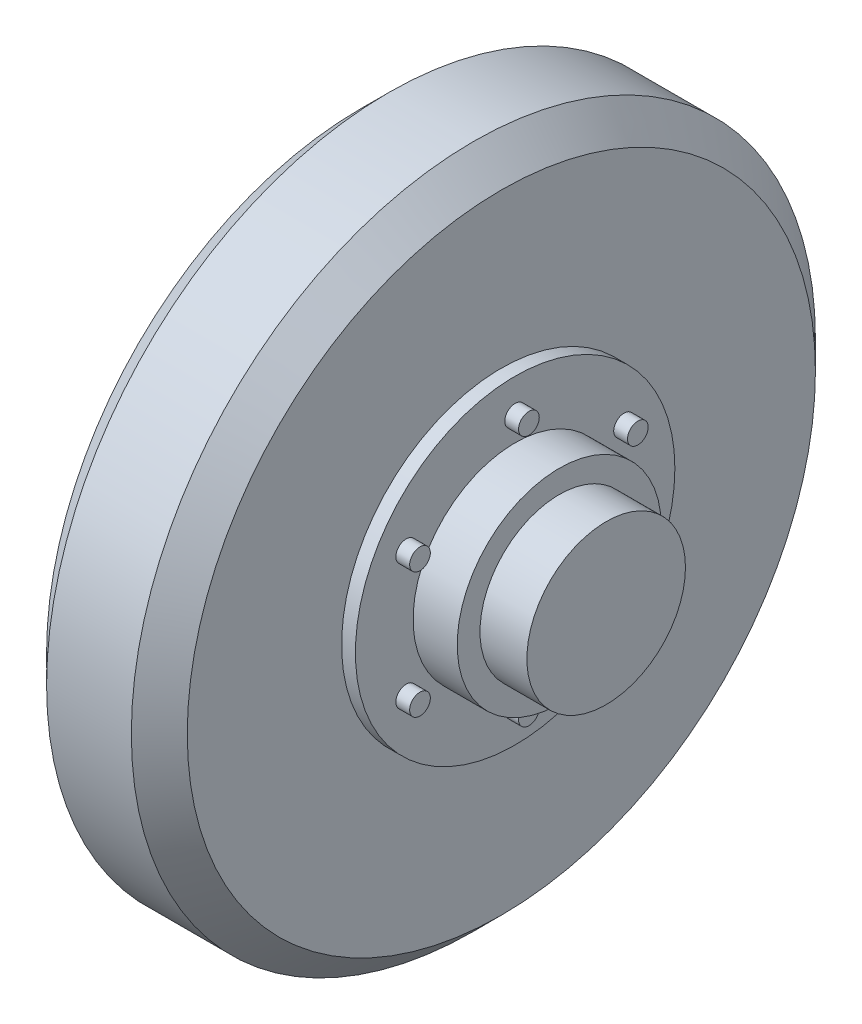
ISO-10303-21;
HEADER;
FILE_DESCRIPTION(('STEP AP214'),'2;1');
FILE_NAME('part.step','',(''),(''),'','','');
FILE_SCHEMA(('AUTOMOTIVE_DESIGN { 1 0 10303 214 1 1 1 1 }'));
ENDSEC;
DATA;
#1=APPLICATION_CONTEXT('core data for automotive mechanical design processes');
#2=APPLICATION_PROTOCOL_DEFINITION('international standard','automotive_design',2000,#1);
#3=PRODUCT_CONTEXT('',#1,'mechanical');
#4=PRODUCT('Part','Part','',(#3));
#5=PRODUCT_RELATED_PRODUCT_CATEGORY('part','',(#4));
#6=PRODUCT_DEFINITION_FORMATION('','',#4);
#7=PRODUCT_DEFINITION_CONTEXT('part definition',#1,'design');
#8=PRODUCT_DEFINITION('design','',#6,#7);
#9=PRODUCT_DEFINITION_SHAPE('','',#8);
#10=(LENGTH_UNIT() NAMED_UNIT(*) SI_UNIT(.MILLI.,.METRE.));
#11=(NAMED_UNIT(*) PLANE_ANGLE_UNIT() SI_UNIT($,.RADIAN.));
#12=(NAMED_UNIT(*) SI_UNIT($,.STERADIAN.) SOLID_ANGLE_UNIT());
#13=UNCERTAINTY_MEASURE_WITH_UNIT(LENGTH_MEASURE(1.E-05),#10,'distance_accuracy_value','');
#14=(GEOMETRIC_REPRESENTATION_CONTEXT(3) GLOBAL_UNCERTAINTY_ASSIGNED_CONTEXT((#13)) GLOBAL_UNIT_ASSIGNED_CONTEXT((#10,
#11,#12)) REPRESENTATION_CONTEXT('',''));
#15=CARTESIAN_POINT('',(0.,0.,0.));
#16=DIRECTION('',(0.,0.,1.));
#17=DIRECTION('',(1.,0.,0.));
#18=AXIS2_PLACEMENT_3D('',#15,#16,#17);
#19=CARTESIAN_POINT('',(20.32,0.,0.));
#20=DIRECTION('',(1.,0.,0.));
#21=DIRECTION('',(0.,0.,-1.));
#22=AXIS2_PLACEMENT_3D('',#19,#20,#21);
#23=PLANE('',#22);
#24=CARTESIAN_POINT('',(20.32,0.,0.));
#25=DIRECTION('',(1.,0.,0.));
#26=DIRECTION('',(0.,0.,-1.));
#27=AXIS2_PLACEMENT_3D('',#24,#25,#26);
#28=CIRCLE('',#27,46.99);
#29=CARTESIAN_POINT('',(20.32,0.,-46.99));
#30=VERTEX_POINT('',#29);
#31=EDGE_CURVE('E85',#30,#30,#28,.T.);
#32=ORIENTED_EDGE('',*,*,#31,.T.);
#33=EDGE_LOOP('',(#32));
#34=FACE_BOUND('',#33,.T.);
#35=CARTESIAN_POINT('',(20.32,0.,0.));
#36=DIRECTION('',(1.,0.,0.));
#37=DIRECTION('',(0.,0.,-1.));
#38=AXIS2_PLACEMENT_3D('',#35,#36,#37);
#39=CIRCLE('',#38,36.5125);
#40=CARTESIAN_POINT('',(20.32,0.,-36.5125));
#41=VERTEX_POINT('',#40);
#42=EDGE_CURVE('E10',#41,#41,#39,.T.);
#43=ORIENTED_EDGE('',*,*,#42,.F.);
#44=EDGE_LOOP('',(#43));
#45=FACE_BOUND('',#44,.T.);
#46=ADVANCED_FACE('F39',(#34,#45),#23,.T.);
#47=CARTESIAN_POINT('',(0.,0.,0.));
#48=DIRECTION('',(1.,0.,0.));
#49=DIRECTION('',(0.,0.,-1.));
#50=AXIS2_PLACEMENT_3D('',#47,#48,#49);
#51=CYLINDRICAL_SURFACE('',#50,36.5125);
#52=CARTESIAN_POINT('',(41.91,0.,0.));
#53=DIRECTION('',(1.,0.,0.));
#54=DIRECTION('',(0.,0.,-1.));
#55=AXIS2_PLACEMENT_3D('',#52,#53,#54);
#56=CIRCLE('',#55,36.5125);
#57=CARTESIAN_POINT('',(41.91,0.,-36.5125));
#58=VERTEX_POINT('',#57);
#59=EDGE_CURVE('E45',#58,#58,#56,.T.);
#60=ORIENTED_EDGE('',*,*,#59,.F.);
#61=EDGE_LOOP('',(#60));
#62=FACE_BOUND('',#61,.T.);
#63=ORIENTED_EDGE('',*,*,#42,.T.);
#64=EDGE_LOOP('',(#63));
#65=FACE_BOUND('',#64,.T.);
#66=ADVANCED_FACE('F184',(#62,#65),#51,.T.);
#67=CARTESIAN_POINT('',(41.91,0.,0.));
#68=DIRECTION('',(1.,0.,0.));
#69=DIRECTION('',(0.,0.,-1.));
#70=AXIS2_PLACEMENT_3D('',#67,#68,#69);
#71=PLANE('',#70);
#72=ORIENTED_EDGE('',*,*,#59,.T.);
#73=EDGE_LOOP('',(#72));
#74=FACE_BOUND('',#73,.T.);
#75=ADVANCED_FACE('F189',(#74),#71,.T.);
#76=CARTESIAN_POINT('',(-90.17,0.,0.));
#77=DIRECTION('',(1.,0.,0.));
#78=DIRECTION('',(0.,0.,-1.));
#79=AXIS2_PLACEMENT_3D('',#76,#77,#78);
#80=PLANE('',#79);
#81=CARTESIAN_POINT('',(-90.17,0.,0.));
#82=DIRECTION('',(1.,0.,0.));
#83=DIRECTION('',(0.,0.,-1.));
#84=AXIS2_PLACEMENT_3D('',#81,#82,#83);
#85=CIRCLE('',#84,24.13);
#86=CARTESIAN_POINT('',(-90.17,0.,-24.13));
#87=VERTEX_POINT('',#86);
#88=EDGE_CURVE('E49',#87,#87,#85,.T.);
#89=ORIENTED_EDGE('',*,*,#88,.F.);
#90=EDGE_LOOP('',(#89));
#91=FACE_BOUND('',#90,.T.);
#92=ADVANCED_FACE('F195',(#91),#80,.F.);
#93=CARTESIAN_POINT('',(0.,0.,0.));
#94=DIRECTION('',(1.,0.,0.));
#95=DIRECTION('',(0.,0.,-1.));
#96=AXIS2_PLACEMENT_3D('',#93,#94,#95);
#97=CYLINDRICAL_SURFACE('',#96,24.13);
#98=ORIENTED_EDGE('',*,*,#88,.T.);
#99=EDGE_LOOP('',(#98));
#100=FACE_BOUND('',#99,.T.);
#101=CARTESIAN_POINT('',(-83.82,0.,0.));
#102=DIRECTION('',(1.,0.,0.));
#103=DIRECTION('',(0.,0.,-1.));
#104=AXIS2_PLACEMENT_3D('',#101,#102,#103);
#105=CIRCLE('',#104,24.13);
#106=CARTESIAN_POINT('',(-83.82,0.,-24.13));
#107=VERTEX_POINT('',#106);
#108=EDGE_CURVE('E53',#107,#107,#105,.T.);
#109=ORIENTED_EDGE('',*,*,#108,.F.);
#110=EDGE_LOOP('',(#109));
#111=FACE_BOUND('',#110,.T.);
#112=ADVANCED_FACE('F200',(#100,#111),#97,.T.);
#113=CARTESIAN_POINT('',(-83.82,0.,0.));
#114=DIRECTION('',(1.,0.,0.));
#115=DIRECTION('',(0.,0.,-1.));
#116=AXIS2_PLACEMENT_3D('',#113,#114,#115);
#117=PLANE('',#116);
#118=ORIENTED_EDGE('',*,*,#108,.T.);
#119=EDGE_LOOP('',(#118));
#120=FACE_BOUND('',#119,.T.);
#121=CARTESIAN_POINT('',(-83.82,0.,0.));
#122=DIRECTION('',(1.,0.,0.));
#123=DIRECTION('',(0.,0.,-1.));
#124=AXIS2_PLACEMENT_3D('',#121,#122,#123);
#125=CIRCLE('',#124,14.9987);
#126=CARTESIAN_POINT('',(-83.82,0.,-14.9987));
#127=VERTEX_POINT('',#126);
#128=EDGE_CURVE('E58',#127,#127,#125,.T.);
#129=ORIENTED_EDGE('',*,*,#128,.F.);
#130=EDGE_LOOP('',(#129));
#131=FACE_BOUND('',#130,.T.);
#132=ADVANCED_FACE('F204',(#120,#131),#117,.T.);
#133=CARTESIAN_POINT('',(0.,0.,0.));
#134=DIRECTION('',(1.,0.,0.));
#135=DIRECTION('',(0.,0.,-1.));
#136=AXIS2_PLACEMENT_3D('',#133,#134,#135);
#137=CYLINDRICAL_SURFACE('',#136,14.9987);
#138=ORIENTED_EDGE('',*,*,#128,.T.);
#139=EDGE_LOOP('',(#138));
#140=FACE_BOUND('',#139,.T.);
#141=CARTESIAN_POINT('',(-71.12,0.,0.));
#142=DIRECTION('',(1.,0.,0.));
#143=DIRECTION('',(0.,0.,-1.));
#144=AXIS2_PLACEMENT_3D('',#141,#142,#143);
#145=CIRCLE('',#144,14.9987);
#146=CARTESIAN_POINT('',(-71.12,0.,-14.9987));
#147=VERTEX_POINT('',#146);
#148=EDGE_CURVE('E61',#147,#147,#145,.T.);
#149=ORIENTED_EDGE('',*,*,#148,.F.);
#150=EDGE_LOOP('',(#149));
#151=FACE_BOUND('',#150,.T.);
#152=ADVANCED_FACE('F208',(#140,#151),#137,.T.);
#153=CARTESIAN_POINT('',(-71.12,0.,0.));
#154=DIRECTION('',(1.,0.,0.));
#155=DIRECTION('',(0.,0.,-1.));
#156=AXIS2_PLACEMENT_3D('',#153,#154,#155);
#157=PLANE('',#156);
#158=CARTESIAN_POINT('',(-71.12,36.2352532708454,-11.7735474856855));
#159=DIRECTION('',(-1.,0.,0.));
#160=DIRECTION('',(0.,0.,1.));
#161=AXIS2_PLACEMENT_3D('',#158,#159,#160);
#162=CIRCLE('',#161,3.3734375);
#163=CARTESIAN_POINT('',(-71.12,36.2352532708454,-8.40010998568549));
#164=VERTEX_POINT('',#163);
#165=EDGE_CURVE('E98',#164,#164,#162,.T.);
#166=ORIENTED_EDGE('',*,*,#165,.F.);
#167=EDGE_LOOP('',(#166));
#168=FACE_BOUND('',#167,.T.);
#169=CARTESIAN_POINT('',(-71.12,0.,-38.1));
#170=DIRECTION('',(-1.,0.,0.));
#171=DIRECTION('',(0.,0.,1.));
#172=AXIS2_PLACEMENT_3D('',#169,#170,#171);
#173=CIRCLE('',#172,3.3734375);
#174=CARTESIAN_POINT('',(-71.12,0.,-34.7265625));
#175=VERTEX_POINT('',#174);
#176=EDGE_CURVE('E105',#175,#175,#173,.T.);
#177=ORIENTED_EDGE('',*,*,#176,.F.);
#178=EDGE_LOOP('',(#177));
#179=FACE_BOUND('',#178,.T.);
#180=CARTESIAN_POINT('',(-71.12,-36.2352532708454,-11.7735474856855));
#181=DIRECTION('',(-1.,0.,0.));
#182=DIRECTION('',(0.,0.,1.));
#183=AXIS2_PLACEMENT_3D('',#180,#181,#182);
#184=CIRCLE('',#183,3.3734375);
#185=CARTESIAN_POINT('',(-71.12,-36.2352532708454,-8.40010998568553));
#186=VERTEX_POINT('',#185);
#187=EDGE_CURVE('E111',#186,#186,#184,.T.);
#188=ORIENTED_EDGE('',*,*,#187,.F.);
#189=EDGE_LOOP('',(#188));
#190=FACE_BOUND('',#189,.T.);
#191=CARTESIAN_POINT('',(-71.12,-22.3946181123433,30.8235474856855));
#192=DIRECTION('',(-1.,0.,0.));
#193=DIRECTION('',(0.,0.,1.));
#194=AXIS2_PLACEMENT_3D('',#191,#192,#193);
#195=CIRCLE('',#194,3.3734375);
#196=CARTESIAN_POINT('',(-71.12,-22.3946181123433,34.1969849856855));
#197=VERTEX_POINT('',#196);
#198=EDGE_CURVE('E92',#197,#197,#195,.T.);
#199=ORIENTED_EDGE('',*,*,#198,.F.);
#200=EDGE_LOOP('',(#199));
#201=FACE_BOUND('',#200,.T.);
#202=CARTESIAN_POINT('',(-71.12,22.3946181123432,30.8235474856855));
#203=DIRECTION('',(-1.,0.,0.));
#204=DIRECTION('',(0.,0.,1.));
#205=AXIS2_PLACEMENT_3D('',#202,#203,#204);
#206=CIRCLE('',#205,3.3734375);
#207=CARTESIAN_POINT('',(-71.12,22.3946181123432,34.1969849856855));
#208=VERTEX_POINT('',#207);
#209=EDGE_CURVE('E89',#208,#208,#206,.T.);
#210=ORIENTED_EDGE('',*,*,#209,.F.);
#211=EDGE_LOOP('',(#210));
#212=FACE_BOUND('',#211,.T.);
#213=CARTESIAN_POINT('',(-71.12,0.,0.));
#214=DIRECTION('',(1.,0.,0.));
#215=DIRECTION('',(0.,0.,-1.));
#216=AXIS2_PLACEMENT_3D('',#213,#214,#215);
#217=CIRCLE('',#216,144.605660923727);
#218=CARTESIAN_POINT('',(-71.12,0.,-144.605660923727));
#219=VERTEX_POINT('',#218);
#220=EDGE_CURVE('E64',#219,#219,#217,.T.);
#221=ORIENTED_EDGE('',*,*,#220,.F.);
#222=EDGE_LOOP('',(#221));
#223=FACE_BOUND('',#222,.T.);
#224=ORIENTED_EDGE('',*,*,#148,.T.);
#225=EDGE_LOOP('',(#224));
#226=FACE_BOUND('',#225,.T.);
#227=ADVANCED_FACE('F212',(#168,#179,#190,#201,#212,#223,#226),#157,.F.);
#228=CARTESIAN_POINT('',(-58.2456609237275,0.,0.));
#229=DIRECTION('',(1.,0.,0.));
#230=DIRECTION('',(0.,0.,-1.));
#231=AXIS2_PLACEMENT_3D('',#228,#229,#230);
#232=CONICAL_SURFACE('',#231,157.48,0.78539816339745);
#233=ORIENTED_EDGE('',*,*,#220,.T.);
#234=EDGE_LOOP('',(#233));
#235=FACE_BOUND('',#234,.T.);
#236=CARTESIAN_POINT('',(-58.2456609237275,0.,0.));
#237=DIRECTION('',(1.,0.,0.));
#238=DIRECTION('',(0.,0.,-1.));
#239=AXIS2_PLACEMENT_3D('',#236,#237,#238);
#240=CIRCLE('',#239,157.48);
#241=CARTESIAN_POINT('',(-58.2456609237275,0.,-157.48));
#242=VERTEX_POINT('',#241);
#243=EDGE_CURVE('E67',#242,#242,#240,.T.);
#244=ORIENTED_EDGE('',*,*,#243,.F.);
#245=EDGE_LOOP('',(#244));
#246=FACE_BOUND('',#245,.T.);
#247=ADVANCED_FACE('F215',(#235,#246),#232,.T.);
#248=CARTESIAN_POINT('',(0.,0.,0.));
#249=DIRECTION('',(1.,0.,0.));
#250=DIRECTION('',(0.,0.,-1.));
#251=AXIS2_PLACEMENT_3D('',#248,#249,#250);
#252=CYLINDRICAL_SURFACE('',#251,157.48);
#253=ORIENTED_EDGE('',*,*,#243,.T.);
#254=EDGE_LOOP('',(#253));
#255=FACE_BOUND('',#254,.T.);
#256=CARTESIAN_POINT('',(-19.2243390762724,0.,0.));
#257=DIRECTION('',(1.,0.,0.));
#258=DIRECTION('',(0.,0.,-1.));
#259=AXIS2_PLACEMENT_3D('',#256,#257,#258);
#260=CIRCLE('',#259,157.48);
#261=CARTESIAN_POINT('',(-19.2243390762724,0.,-157.48));
#262=VERTEX_POINT('',#261);
#263=EDGE_CURVE('E70',#262,#262,#260,.T.);
#264=ORIENTED_EDGE('',*,*,#263,.F.);
#265=EDGE_LOOP('',(#264));
#266=FACE_BOUND('',#265,.T.);
#267=ADVANCED_FACE('F219',(#255,#266),#252,.T.);
#268=CARTESIAN_POINT('',(-6.34999999999999,0.,0.));
#269=DIRECTION('',(-1.,0.,0.));
#270=DIRECTION('',(0.,0.,1.));
#271=AXIS2_PLACEMENT_3D('',#268,#269,#270);
#272=CONICAL_SURFACE('',#271,144.605660923727,0.785398163397451);
#273=ORIENTED_EDGE('',*,*,#263,.T.);
#274=EDGE_LOOP('',(#273));
#275=FACE_BOUND('',#274,.T.);
#276=CARTESIAN_POINT('',(-6.34999999999999,0.,0.));
#277=DIRECTION('',(1.,0.,0.));
#278=DIRECTION('',(0.,0.,-1.));
#279=AXIS2_PLACEMENT_3D('',#276,#277,#278);
#280=CIRCLE('',#279,144.605660923727);
#281=CARTESIAN_POINT('',(-6.34999999999999,0.,-144.605660923727));
#282=VERTEX_POINT('',#281);
#283=EDGE_CURVE('E73',#282,#282,#280,.T.);
#284=ORIENTED_EDGE('',*,*,#283,.F.);
#285=EDGE_LOOP('',(#284));
#286=FACE_BOUND('',#285,.T.);
#287=ADVANCED_FACE('F223',(#275,#286),#272,.T.);
#288=CARTESIAN_POINT('',(-6.34999999999999,0.,0.));
#289=DIRECTION('',(1.,0.,0.));
#290=DIRECTION('',(0.,0.,-1.));
#291=AXIS2_PLACEMENT_3D('',#288,#289,#290);
#292=PLANE('',#291);
#293=ORIENTED_EDGE('',*,*,#283,.T.);
#294=EDGE_LOOP('',(#293));
#295=FACE_BOUND('',#294,.T.);
#296=CARTESIAN_POINT('',(-6.34999999999999,0.,0.));
#297=DIRECTION('',(1.,0.,0.));
#298=DIRECTION('',(0.,0.,-1.));
#299=AXIS2_PLACEMENT_3D('',#296,#297,#298);
#300=CIRCLE('',#299,73.5501232622492);
#301=CARTESIAN_POINT('',(-6.34999999999999,0.,-73.5501232622492));
#302=VERTEX_POINT('',#301);
#303=EDGE_CURVE('E76',#302,#302,#300,.T.);
#304=ORIENTED_EDGE('',*,*,#303,.F.);
#305=EDGE_LOOP('',(#304));
#306=FACE_BOUND('',#305,.T.);
#307=ADVANCED_FACE('F227',(#295,#306),#292,.T.);
#308=CARTESIAN_POINT('',(0.,0.,0.));
#309=DIRECTION('',(1.,0.,0.));
#310=DIRECTION('',(0.,0.,-1.));
#311=AXIS2_PLACEMENT_3D('',#308,#309,#310);
#312=CYLINDRICAL_SURFACE('',#311,73.5501232622492);
#313=ORIENTED_EDGE('',*,*,#303,.T.);
#314=EDGE_LOOP('',(#313));
#315=FACE_BOUND('',#314,.T.);
#316=CARTESIAN_POINT('',(0.,0.,0.));
#317=DIRECTION('',(1.,0.,0.));
#318=DIRECTION('',(0.,0.,-1.));
#319=AXIS2_PLACEMENT_3D('',#316,#317,#318);
#320=CIRCLE('',#319,73.5501232622492);
#321=CARTESIAN_POINT('',(0.,0.,-73.5501232622492));
#322=VERTEX_POINT('',#321);
#323=EDGE_CURVE('E79',#322,#322,#320,.T.);
#324=ORIENTED_EDGE('',*,*,#323,.F.);
#325=EDGE_LOOP('',(#324));
#326=FACE_BOUND('',#325,.T.);
#327=ADVANCED_FACE('F161',(#315,#326),#312,.T.);
#328=CARTESIAN_POINT('',(0.,0.,0.));
#329=DIRECTION('',(1.,0.,0.));
#330=DIRECTION('',(0.,0.,-1.));
#331=AXIS2_PLACEMENT_3D('',#328,#329,#330);
#332=PLANE('',#331);
#333=CARTESIAN_POINT('',(0.,57.912,0.));
#334=DIRECTION('',(1.,0.,0.));
#335=DIRECTION('',(0.,0.,-1.));
#336=AXIS2_PLACEMENT_3D('',#333,#334,#335);
#337=CIRCLE('',#336,4.7625);
#338=CARTESIAN_POINT('',(0.,57.912,-4.7625));
#339=VERTEX_POINT('',#338);
#340=EDGE_CURVE('E128',#339,#339,#337,.T.);
#341=ORIENTED_EDGE('',*,*,#340,.F.);
#342=EDGE_LOOP('',(#341));
#343=FACE_BOUND('',#342,.T.);
#344=CARTESIAN_POINT('',(0.,28.956,-50.1532631839644));
#345=DIRECTION('',(1.,0.,0.));
#346=DIRECTION('',(0.,0.,-1.));
#347=AXIS2_PLACEMENT_3D('',#344,#345,#346);
#348=CIRCLE('',#347,4.7625);
#349=CARTESIAN_POINT('',(0.,28.956,-54.9157631839644));
#350=VERTEX_POINT('',#349);
#351=EDGE_CURVE('E134',#350,#350,#348,.T.);
#352=ORIENTED_EDGE('',*,*,#351,.F.);
#353=EDGE_LOOP('',(#352));
#354=FACE_BOUND('',#353,.T.);
#355=CARTESIAN_POINT('',(0.,-28.956,-50.1532631839644));
#356=DIRECTION('',(1.,0.,0.));
#357=DIRECTION('',(0.,0.,-1.));
#358=AXIS2_PLACEMENT_3D('',#355,#356,#357);
#359=CIRCLE('',#358,4.7625);
#360=CARTESIAN_POINT('',(0.,-28.956,-54.9157631839644));
#361=VERTEX_POINT('',#360);
#362=EDGE_CURVE('E140',#361,#361,#359,.T.);
#363=ORIENTED_EDGE('',*,*,#362,.F.);
#364=EDGE_LOOP('',(#363));
#365=FACE_BOUND('',#364,.T.);
#366=CARTESIAN_POINT('',(0.,-57.912,0.));
#367=DIRECTION('',(1.,0.,0.));
#368=DIRECTION('',(0.,0.,-1.));
#369=AXIS2_PLACEMENT_3D('',#366,#367,#368);
#370=CIRCLE('',#369,4.7625);
#371=CARTESIAN_POINT('',(0.,-57.912,-4.7625));
#372=VERTEX_POINT('',#371);
#373=EDGE_CURVE('E146',#372,#372,#370,.T.);
#374=ORIENTED_EDGE('',*,*,#373,.F.);
#375=EDGE_LOOP('',(#374));
#376=FACE_BOUND('',#375,.T.);
#377=CARTESIAN_POINT('',(0.,-28.956,50.1532631839644));
#378=DIRECTION('',(1.,0.,0.));
#379=DIRECTION('',(0.,0.,-1.));
#380=AXIS2_PLACEMENT_3D('',#377,#378,#379);
#381=CIRCLE('',#380,4.7625);
#382=CARTESIAN_POINT('',(0.,-28.956,45.3907631839644));
#383=VERTEX_POINT('',#382);
#384=EDGE_CURVE('E122',#383,#383,#381,.T.);
#385=ORIENTED_EDGE('',*,*,#384,.F.);
#386=EDGE_LOOP('',(#385));
#387=FACE_BOUND('',#386,.T.);
#388=CARTESIAN_POINT('',(0.,28.956,50.1532631839644));
#389=DIRECTION('',(1.,0.,0.));
#390=DIRECTION('',(0.,0.,-1.));
#391=AXIS2_PLACEMENT_3D('',#388,#389,#390);
#392=CIRCLE('',#391,4.7625);
#393=CARTESIAN_POINT('',(0.,28.956,45.3907631839644));
#394=VERTEX_POINT('',#393);
#395=EDGE_CURVE('E119',#394,#394,#392,.T.);
#396=ORIENTED_EDGE('',*,*,#395,.F.);
#397=EDGE_LOOP('',(#396));
#398=FACE_BOUND('',#397,.T.);
#399=ORIENTED_EDGE('',*,*,#323,.T.);
#400=EDGE_LOOP('',(#399));
#401=FACE_BOUND('',#400,.T.);
#402=CARTESIAN_POINT('',(0.,0.,0.));
#403=DIRECTION('',(1.,0.,0.));
#404=DIRECTION('',(0.,0.,-1.));
#405=AXIS2_PLACEMENT_3D('',#402,#403,#404);
#406=CIRCLE('',#405,46.99);
#407=CARTESIAN_POINT('',(0.,0.,-46.99));
#408=VERTEX_POINT('',#407);
#409=EDGE_CURVE('E82',#408,#408,#406,.T.);
#410=ORIENTED_EDGE('',*,*,#409,.F.);
#411=EDGE_LOOP('',(#410));
#412=FACE_BOUND('',#411,.T.);
#413=ADVANCED_FACE('F157',(#343,#354,#365,#376,#387,#398,#401,#412),#332,.T.);
#414=CARTESIAN_POINT('',(0.,0.,0.));
#415=DIRECTION('',(1.,0.,0.));
#416=DIRECTION('',(0.,0.,-1.));
#417=AXIS2_PLACEMENT_3D('',#414,#415,#416);
#418=CYLINDRICAL_SURFACE('',#417,46.99);
#419=ORIENTED_EDGE('',*,*,#31,.F.);
#420=EDGE_LOOP('',(#419));
#421=FACE_BOUND('',#420,.T.);
#422=ORIENTED_EDGE('',*,*,#409,.T.);
#423=EDGE_LOOP('',(#422));
#424=FACE_BOUND('',#423,.T.);
#425=ADVANCED_FACE('F160',(#421,#424),#418,.T.);
#426=CARTESIAN_POINT('',(-59.69,22.3946181123432,30.8235474856855));
#427=DIRECTION('',(-1.,0.,0.));
#428=DIRECTION('',(0.,0.,1.));
#429=AXIS2_PLACEMENT_3D('',#426,#427,#428);
#430=CYLINDRICAL_SURFACE('',#429,3.3734375);
#431=CARTESIAN_POINT('',(-59.69,22.3946181123432,30.8235474856855));
#432=DIRECTION('',(-1.,0.,0.));
#433=DIRECTION('',(0.,0.,1.));
#434=AXIS2_PLACEMENT_3D('',#431,#432,#433);
#435=CIRCLE('',#434,3.3734375);
#436=CARTESIAN_POINT('',(-59.69,22.3946181123432,34.1969849856855));
#437=VERTEX_POINT('',#436);
#438=EDGE_CURVE('E88',#437,#437,#435,.T.);
#439=ORIENTED_EDGE('',*,*,#438,.F.);
#440=EDGE_LOOP('',(#439));
#441=FACE_BOUND('',#440,.T.);
#442=ORIENTED_EDGE('',*,*,#209,.T.);
#443=EDGE_LOOP('',(#442));
#444=FACE_BOUND('',#443,.T.);
#445=ADVANCED_FACE('F171',(#441,#444),#430,.F.);
#446=CARTESIAN_POINT('',(-59.69,22.3946181123432,30.8235474856855));
#447=DIRECTION('',(-1.,0.,0.));
#448=DIRECTION('',(0.,0.,1.));
#449=AXIS2_PLACEMENT_3D('',#446,#447,#448);
#450=PLANE('',#449);
#451=ORIENTED_EDGE('',*,*,#438,.T.);
#452=EDGE_LOOP('',(#451));
#453=FACE_BOUND('',#452,.T.);
#454=ADVANCED_FACE('F179',(#453),#450,.T.);
#455=CARTESIAN_POINT('',(-59.69,-22.3946181123433,30.8235474856855));
#456=DIRECTION('',(-1.,0.,0.));
#457=DIRECTION('',(0.,0.,1.));
#458=AXIS2_PLACEMENT_3D('',#455,#456,#457);
#459=CYLINDRICAL_SURFACE('',#458,3.3734375);
#460=CARTESIAN_POINT('',(-59.69,-22.3946181123433,30.8235474856855));
#461=DIRECTION('',(-1.,0.,0.));
#462=DIRECTION('',(0.,0.,1.));
#463=AXIS2_PLACEMENT_3D('',#460,#461,#462);
#464=CIRCLE('',#463,3.3734375);
#465=CARTESIAN_POINT('',(-59.69,-22.3946181123433,34.1969849856855));
#466=VERTEX_POINT('',#465);
#467=EDGE_CURVE('E114',#466,#466,#464,.T.);
#468=ORIENTED_EDGE('',*,*,#467,.F.);
#469=EDGE_LOOP('',(#468));
#470=FACE_BOUND('',#469,.T.);
#471=ORIENTED_EDGE('',*,*,#198,.T.);
#472=EDGE_LOOP('',(#471));
#473=FACE_BOUND('',#472,.T.);
#474=ADVANCED_FACE('F336',(#470,#473),#459,.F.);
#475=CARTESIAN_POINT('',(-59.69,-22.3946181123433,30.8235474856855));
#476=DIRECTION('',(-1.,0.,0.));
#477=DIRECTION('',(0.,0.,1.));
#478=AXIS2_PLACEMENT_3D('',#475,#476,#477);
#479=PLANE('',#478);
#480=ORIENTED_EDGE('',*,*,#467,.T.);
#481=EDGE_LOOP('',(#480));
#482=FACE_BOUND('',#481,.T.);
#483=ADVANCED_FACE('F345',(#482),#479,.T.);
#484=CARTESIAN_POINT('',(-59.69,-36.2352532708454,-11.7735474856855));
#485=DIRECTION('',(-1.,0.,0.));
#486=DIRECTION('',(0.,0.,1.));
#487=AXIS2_PLACEMENT_3D('',#484,#485,#486);
#488=CYLINDRICAL_SURFACE('',#487,3.3734375);
#489=CARTESIAN_POINT('',(-59.69,-36.2352532708454,-11.7735474856855));
#490=DIRECTION('',(-1.,0.,0.));
#491=DIRECTION('',(0.,0.,1.));
#492=AXIS2_PLACEMENT_3D('',#489,#490,#491);
#493=CIRCLE('',#492,3.3734375);
#494=CARTESIAN_POINT('',(-59.69,-36.2352532708454,-8.40010998568553));
#495=VERTEX_POINT('',#494);
#496=EDGE_CURVE('E108',#495,#495,#493,.T.);
#497=ORIENTED_EDGE('',*,*,#496,.F.);
#498=EDGE_LOOP('',(#497));
#499=FACE_BOUND('',#498,.T.);
#500=ORIENTED_EDGE('',*,*,#187,.T.);
#501=EDGE_LOOP('',(#500));
#502=FACE_BOUND('',#501,.T.);
#503=ADVANCED_FACE('F354',(#499,#502),#488,.F.);
#504=CARTESIAN_POINT('',(-59.69,-36.2352532708454,-11.7735474856855));
#505=DIRECTION('',(-1.,0.,0.));
#506=DIRECTION('',(0.,0.,1.));
#507=AXIS2_PLACEMENT_3D('',#504,#505,#506);
#508=PLANE('',#507);
#509=ORIENTED_EDGE('',*,*,#496,.T.);
#510=EDGE_LOOP('',(#509));
#511=FACE_BOUND('',#510,.T.);
#512=ADVANCED_FACE('F363',(#511),#508,.T.);
#513=CARTESIAN_POINT('',(-59.69,0.,-38.1));
#514=DIRECTION('',(-1.,0.,0.));
#515=DIRECTION('',(0.,0.,1.));
#516=AXIS2_PLACEMENT_3D('',#513,#514,#515);
#517=CYLINDRICAL_SURFACE('',#516,3.3734375);
#518=CARTESIAN_POINT('',(-59.69,0.,-38.1));
#519=DIRECTION('',(-1.,0.,0.));
#520=DIRECTION('',(0.,0.,1.));
#521=AXIS2_PLACEMENT_3D('',#518,#519,#520);
#522=CIRCLE('',#521,3.3734375);
#523=CARTESIAN_POINT('',(-59.69,0.,-34.7265625));
#524=VERTEX_POINT('',#523);
#525=EDGE_CURVE('E102',#524,#524,#522,.T.);
#526=ORIENTED_EDGE('',*,*,#525,.F.);
#527=EDGE_LOOP('',(#526));
#528=FACE_BOUND('',#527,.T.);
#529=ORIENTED_EDGE('',*,*,#176,.T.);
#530=EDGE_LOOP('',(#529));
#531=FACE_BOUND('',#530,.T.);
#532=ADVANCED_FACE('F372',(#528,#531),#517,.F.);
#533=CARTESIAN_POINT('',(-59.69,0.,-38.1));
#534=DIRECTION('',(-1.,0.,0.));
#535=DIRECTION('',(0.,0.,1.));
#536=AXIS2_PLACEMENT_3D('',#533,#534,#535);
#537=PLANE('',#536);
#538=ORIENTED_EDGE('',*,*,#525,.T.);
#539=EDGE_LOOP('',(#538));
#540=FACE_BOUND('',#539,.T.);
#541=ADVANCED_FACE('F381',(#540),#537,.T.);
#542=CARTESIAN_POINT('',(-59.69,36.2352532708454,-11.7735474856855));
#543=DIRECTION('',(-1.,0.,0.));
#544=DIRECTION('',(0.,0.,1.));
#545=AXIS2_PLACEMENT_3D('',#542,#543,#544);
#546=CYLINDRICAL_SURFACE('',#545,3.3734375);
#547=CARTESIAN_POINT('',(-59.69,36.2352532708454,-11.7735474856855));
#548=DIRECTION('',(-1.,0.,0.));
#549=DIRECTION('',(0.,0.,1.));
#550=AXIS2_PLACEMENT_3D('',#547,#548,#549);
#551=CIRCLE('',#550,3.3734375);
#552=CARTESIAN_POINT('',(-59.69,36.2352532708454,-8.40010998568549));
#553=VERTEX_POINT('',#552);
#554=EDGE_CURVE('E95',#553,#553,#551,.T.);
#555=ORIENTED_EDGE('',*,*,#554,.F.);
#556=EDGE_LOOP('',(#555));
#557=FACE_BOUND('',#556,.T.);
#558=ORIENTED_EDGE('',*,*,#165,.T.);
#559=EDGE_LOOP('',(#558));
#560=FACE_BOUND('',#559,.T.);
#561=ADVANCED_FACE('F390',(#557,#560),#546,.F.);
#562=CARTESIAN_POINT('',(-59.69,36.2352532708454,-11.7735474856855));
#563=DIRECTION('',(-1.,0.,0.));
#564=DIRECTION('',(0.,0.,1.));
#565=AXIS2_PLACEMENT_3D('',#562,#563,#564);
#566=PLANE('',#565);
#567=ORIENTED_EDGE('',*,*,#554,.T.);
#568=EDGE_LOOP('',(#567));
#569=FACE_BOUND('',#568,.T.);
#570=ADVANCED_FACE('F399',(#569),#566,.T.);
#571=CARTESIAN_POINT('',(6.35,28.956,50.1532631839644));
#572=DIRECTION('',(-1.,0.,0.));
#573=DIRECTION('',(0.,0.,1.));
#574=AXIS2_PLACEMENT_3D('',#571,#572,#573);
#575=CYLINDRICAL_SURFACE('',#574,4.7625);
#576=CARTESIAN_POINT('',(6.35,28.956,50.1532631839644));
#577=DIRECTION('',(1.,0.,0.));
#578=DIRECTION('',(0.,0.,-1.));
#579=AXIS2_PLACEMENT_3D('',#576,#577,#578);
#580=CIRCLE('',#579,4.7625);
#581=CARTESIAN_POINT('',(6.35,28.956,45.3907631839644));
#582=VERTEX_POINT('',#581);
#583=EDGE_CURVE('E99',#582,#582,#580,.T.);
#584=ORIENTED_EDGE('',*,*,#583,.F.);
#585=EDGE_LOOP('',(#584));
#586=FACE_BOUND('',#585,.T.);
#587=ORIENTED_EDGE('',*,*,#395,.T.);
#588=EDGE_LOOP('',(#587));
#589=FACE_BOUND('',#588,.T.);
#590=ADVANCED_FACE('F408',(#586,#589),#575,.T.);
#591=CARTESIAN_POINT('',(6.35,28.956,50.1532631839644));
#592=DIRECTION('',(1.,0.,0.));
#593=DIRECTION('',(0.,0.,-1.));
#594=AXIS2_PLACEMENT_3D('',#591,#592,#593);
#595=PLANE('',#594);
#596=ORIENTED_EDGE('',*,*,#583,.T.);
#597=EDGE_LOOP('',(#596));
#598=FACE_BOUND('',#597,.T.);
#599=ADVANCED_FACE('F417',(#598),#595,.T.);
#600=CARTESIAN_POINT('',(6.35,-28.956,50.1532631839644));
#601=DIRECTION('',(-1.,0.,0.));
#602=DIRECTION('',(0.,0.,1.));
#603=AXIS2_PLACEMENT_3D('',#600,#601,#602);
#604=CYLINDRICAL_SURFACE('',#603,4.7625);
#605=CARTESIAN_POINT('',(6.35,-28.956,50.1532631839644));
#606=DIRECTION('',(1.,0.,0.));
#607=DIRECTION('',(0.,0.,-1.));
#608=AXIS2_PLACEMENT_3D('',#605,#606,#607);
#609=CIRCLE('',#608,4.7625);
#610=CARTESIAN_POINT('',(6.35,-28.956,45.3907631839644));
#611=VERTEX_POINT('',#610);
#612=EDGE_CURVE('E149',#611,#611,#609,.T.);
#613=ORIENTED_EDGE('',*,*,#612,.F.);
#614=EDGE_LOOP('',(#613));
#615=FACE_BOUND('',#614,.T.);
#616=ORIENTED_EDGE('',*,*,#384,.T.);
#617=EDGE_LOOP('',(#616));
#618=FACE_BOUND('',#617,.T.);
#619=ADVANCED_FACE('F155',(#615,#618),#604,.T.);
#620=CARTESIAN_POINT('',(6.35,-28.956,50.1532631839644));
#621=DIRECTION('',(1.,0.,0.));
#622=DIRECTION('',(0.,0.,-1.));
#623=AXIS2_PLACEMENT_3D('',#620,#621,#622);
#624=PLANE('',#623);
#625=ORIENTED_EDGE('',*,*,#612,.T.);
#626=EDGE_LOOP('',(#625));
#627=FACE_BOUND('',#626,.T.);
#628=ADVANCED_FACE('F434',(#627),#624,.T.);
#629=CARTESIAN_POINT('',(6.35,-57.912,0.));
#630=DIRECTION('',(-1.,0.,0.));
#631=DIRECTION('',(0.,0.,1.));
#632=AXIS2_PLACEMENT_3D('',#629,#630,#631);
#633=CYLINDRICAL_SURFACE('',#632,4.7625);
#634=CARTESIAN_POINT('',(6.35,-57.912,0.));
#635=DIRECTION('',(1.,0.,0.));
#636=DIRECTION('',(0.,0.,-1.));
#637=AXIS2_PLACEMENT_3D('',#634,#635,#636);
#638=CIRCLE('',#637,4.7625);
#639=CARTESIAN_POINT('',(6.35,-57.912,-4.7625));
#640=VERTEX_POINT('',#639);
#641=EDGE_CURVE('E143',#640,#640,#638,.T.);
#642=ORIENTED_EDGE('',*,*,#641,.F.);
#643=EDGE_LOOP('',(#642));
#644=FACE_BOUND('',#643,.T.);
#645=ORIENTED_EDGE('',*,*,#373,.T.);
#646=EDGE_LOOP('',(#645));
#647=FACE_BOUND('',#646,.T.);
#648=ADVANCED_FACE('F443',(#644,#647),#633,.T.);
#649=CARTESIAN_POINT('',(6.35,-57.912,0.));
#650=DIRECTION('',(1.,0.,0.));
#651=DIRECTION('',(0.,0.,-1.));
#652=AXIS2_PLACEMENT_3D('',#649,#650,#651);
#653=PLANE('',#652);
#654=ORIENTED_EDGE('',*,*,#641,.T.);
#655=EDGE_LOOP('',(#654));
#656=FACE_BOUND('',#655,.T.);
#657=ADVANCED_FACE('F452',(#656),#653,.T.);
#658=CARTESIAN_POINT('',(6.35,-28.956,-50.1532631839644));
#659=DIRECTION('',(-1.,0.,0.));
#660=DIRECTION('',(0.,0.,1.));
#661=AXIS2_PLACEMENT_3D('',#658,#659,#660);
#662=CYLINDRICAL_SURFACE('',#661,4.7625);
#663=CARTESIAN_POINT('',(6.35,-28.956,-50.1532631839644));
#664=DIRECTION('',(1.,0.,0.));
#665=DIRECTION('',(0.,0.,-1.));
#666=AXIS2_PLACEMENT_3D('',#663,#664,#665);
#667=CIRCLE('',#666,4.7625);
#668=CARTESIAN_POINT('',(6.35,-28.956,-54.9157631839644));
#669=VERTEX_POINT('',#668);
#670=EDGE_CURVE('E137',#669,#669,#667,.T.);
#671=ORIENTED_EDGE('',*,*,#670,.F.);
#672=EDGE_LOOP('',(#671));
#673=FACE_BOUND('',#672,.T.);
#674=ORIENTED_EDGE('',*,*,#362,.T.);
#675=EDGE_LOOP('',(#674));
#676=FACE_BOUND('',#675,.T.);
#677=ADVANCED_FACE('F461',(#673,#676),#662,.T.);
#678=CARTESIAN_POINT('',(6.35,-28.956,-50.1532631839644));
#679=DIRECTION('',(1.,0.,0.));
#680=DIRECTION('',(0.,0.,-1.));
#681=AXIS2_PLACEMENT_3D('',#678,#679,#680);
#682=PLANE('',#681);
#683=ORIENTED_EDGE('',*,*,#670,.T.);
#684=EDGE_LOOP('',(#683));
#685=FACE_BOUND('',#684,.T.);
#686=ADVANCED_FACE('F470',(#685),#682,.T.);
#687=CARTESIAN_POINT('',(6.35,28.956,-50.1532631839644));
#688=DIRECTION('',(-1.,0.,0.));
#689=DIRECTION('',(0.,0.,1.));
#690=AXIS2_PLACEMENT_3D('',#687,#688,#689);
#691=CYLINDRICAL_SURFACE('',#690,4.7625);
#692=CARTESIAN_POINT('',(6.35,28.956,-50.1532631839644));
#693=DIRECTION('',(1.,0.,0.));
#694=DIRECTION('',(0.,0.,-1.));
#695=AXIS2_PLACEMENT_3D('',#692,#693,#694);
#696=CIRCLE('',#695,4.7625);
#697=CARTESIAN_POINT('',(6.35,28.956,-54.9157631839644));
#698=VERTEX_POINT('',#697);
#699=EDGE_CURVE('E131',#698,#698,#696,.T.);
#700=ORIENTED_EDGE('',*,*,#699,.F.);
#701=EDGE_LOOP('',(#700));
#702=FACE_BOUND('',#701,.T.);
#703=ORIENTED_EDGE('',*,*,#351,.T.);
#704=EDGE_LOOP('',(#703));
#705=FACE_BOUND('',#704,.T.);
#706=ADVANCED_FACE('F479',(#702,#705),#691,.T.);
#707=CARTESIAN_POINT('',(6.35,28.956,-50.1532631839644));
#708=DIRECTION('',(1.,0.,0.));
#709=DIRECTION('',(0.,0.,-1.));
#710=AXIS2_PLACEMENT_3D('',#707,#708,#709);
#711=PLANE('',#710);
#712=ORIENTED_EDGE('',*,*,#699,.T.);
#713=EDGE_LOOP('',(#712));
#714=FACE_BOUND('',#713,.T.);
#715=ADVANCED_FACE('F488',(#714),#711,.T.);
#716=CARTESIAN_POINT('',(6.35,57.912,0.));
#717=DIRECTION('',(-1.,0.,0.));
#718=DIRECTION('',(0.,0.,1.));
#719=AXIS2_PLACEMENT_3D('',#716,#717,#718);
#720=CYLINDRICAL_SURFACE('',#719,4.7625);
#721=CARTESIAN_POINT('',(6.35,57.912,0.));
#722=DIRECTION('',(1.,0.,0.));
#723=DIRECTION('',(0.,0.,-1.));
#724=AXIS2_PLACEMENT_3D('',#721,#722,#723);
#725=CIRCLE('',#724,4.7625);
#726=CARTESIAN_POINT('',(6.35,57.912,-4.7625));
#727=VERTEX_POINT('',#726);
#728=EDGE_CURVE('E125',#727,#727,#725,.T.);
#729=ORIENTED_EDGE('',*,*,#728,.F.);
#730=EDGE_LOOP('',(#729));
#731=FACE_BOUND('',#730,.T.);
#732=ORIENTED_EDGE('',*,*,#340,.T.);
#733=EDGE_LOOP('',(#732));
#734=FACE_BOUND('',#733,.T.);
#735=ADVANCED_FACE('F497',(#731,#734),#720,.T.);
#736=CARTESIAN_POINT('',(6.35,57.912,0.));
#737=DIRECTION('',(1.,0.,0.));
#738=DIRECTION('',(0.,0.,-1.));
#739=AXIS2_PLACEMENT_3D('',#736,#737,#738);
#740=PLANE('',#739);
#741=ORIENTED_EDGE('',*,*,#728,.T.);
#742=EDGE_LOOP('',(#741));
#743=FACE_BOUND('',#742,.T.);
#744=ADVANCED_FACE('F506',(#743),#740,.T.);
#745=CLOSED_SHELL('',(#46,#66,#75,#92,#112,#132,#152,#227,#247,#267,#287,#307,#327,#413,#425,
#445,#454,#474,#483,#503,#512,#532,#541,#561,#570,#590,#599,#619,#628,#648,#657,#677,#686,#706,
#715,#735,#744));
#746=MANIFOLD_SOLID_BREP('B2',#745);
#747=ADVANCED_BREP_SHAPE_REPRESENTATION('',(#18,#746),#14);
#748=SHAPE_DEFINITION_REPRESENTATION(#9,#747);
ENDSEC;
END-ISO-10303-21;
